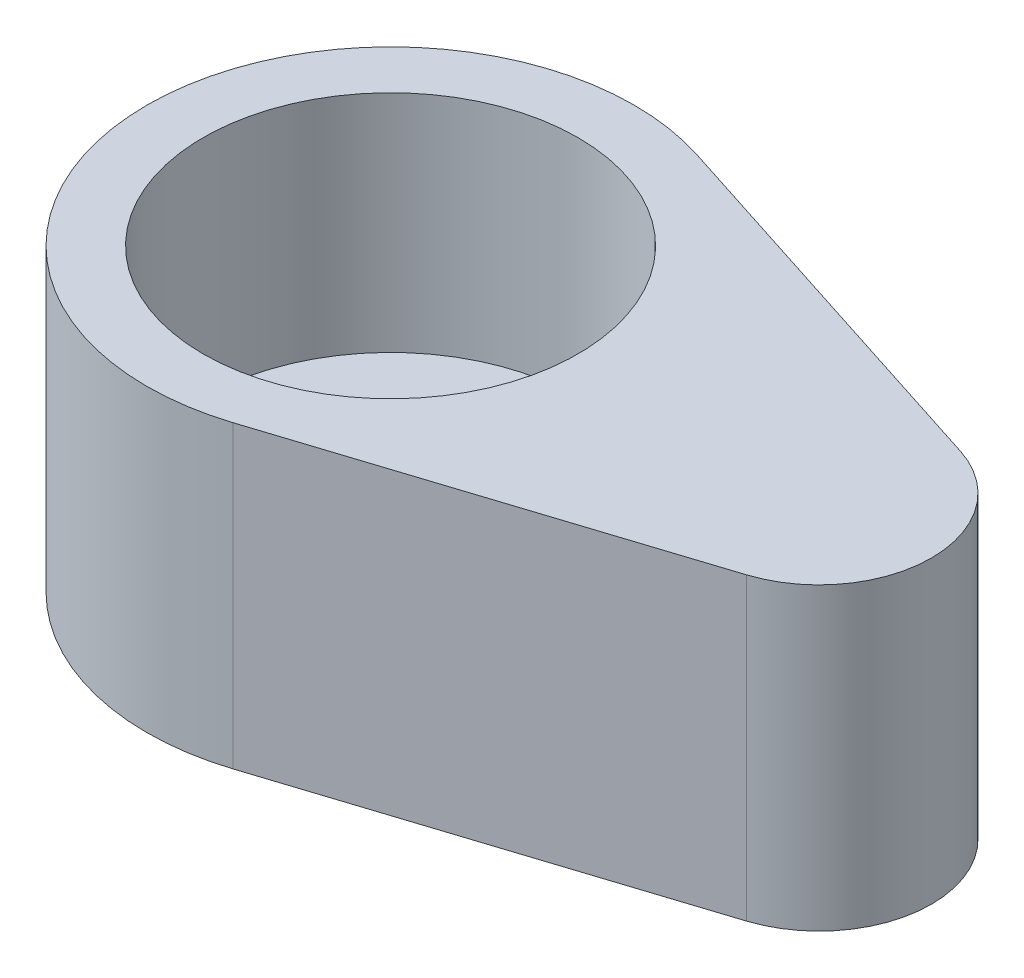
ISO-10303-21;
HEADER;
FILE_DESCRIPTION(('STEP AP214'),'2;1');
FILE_NAME('part.step','',(''),(''),'','','');
FILE_SCHEMA(('AUTOMOTIVE_DESIGN { 1 0 10303 214 1 1 1 1 }'));
ENDSEC;
DATA;
#1=APPLICATION_CONTEXT('core data for automotive mechanical design processes');
#2=APPLICATION_PROTOCOL_DEFINITION('international standard','automotive_design',2000,#1);
#3=PRODUCT_CONTEXT('',#1,'mechanical');
#4=PRODUCT('Part','Part','',(#3));
#5=PRODUCT_RELATED_PRODUCT_CATEGORY('part','',(#4));
#6=PRODUCT_DEFINITION_FORMATION('','',#4);
#7=PRODUCT_DEFINITION_CONTEXT('part definition',#1,'design');
#8=PRODUCT_DEFINITION('design','',#6,#7);
#9=PRODUCT_DEFINITION_SHAPE('','',#8);
#10=(LENGTH_UNIT() NAMED_UNIT(*) SI_UNIT(.MILLI.,.METRE.));
#11=(NAMED_UNIT(*) PLANE_ANGLE_UNIT() SI_UNIT($,.RADIAN.));
#12=(NAMED_UNIT(*) SI_UNIT($,.STERADIAN.) SOLID_ANGLE_UNIT());
#13=UNCERTAINTY_MEASURE_WITH_UNIT(LENGTH_MEASURE(1.E-05),#10,'distance_accuracy_value','');
#14=(GEOMETRIC_REPRESENTATION_CONTEXT(3) GLOBAL_UNCERTAINTY_ASSIGNED_CONTEXT((#13)) GLOBAL_UNIT_ASSIGNED_CONTEXT((#10,
#11,#12)) REPRESENTATION_CONTEXT('',''));
#15=CARTESIAN_POINT('',(0.,0.,0.));
#16=DIRECTION('',(0.,0.,1.));
#17=DIRECTION('',(1.,0.,0.));
#18=AXIS2_PLACEMENT_3D('',#15,#16,#17);
#19=CARTESIAN_POINT('',(0.,8.000000002,0.));
#20=DIRECTION('',(0.,-1.,0.));
#21=DIRECTION('',(0.,0.,-1.));
#22=AXIS2_PLACEMENT_3D('',#19,#20,#21);
#23=CYLINDRICAL_SURFACE('',#22,6.5);
#24=CARTESIAN_POINT('',(0.,0.,0.));
#25=DIRECTION('',(0.,1.,0.));
#26=DIRECTION('',(0.,0.,1.));
#27=AXIS2_PLACEMENT_3D('',#24,#25,#26);
#28=CIRCLE('',#27,6.5);
#29=CARTESIAN_POINT('',(1.99037620297463,0.,-6.18776232337929));
#30=VERTEX_POINT('',#29);
#31=CARTESIAN_POINT('',(1.99037620297463,0.,6.18776232337929));
#32=VERTEX_POINT('',#31);
#33=EDGE_CURVE('E109',#30,#32,#28,.T.);
#34=ORIENTED_EDGE('',*,*,#33,.T.);
#35=DIRECTION('',(0.,-1.,0.));
#36=VECTOR('',#35,1.);
#37=CARTESIAN_POINT('',(1.99037620297463,8.000000002,6.18776232337929));
#38=LINE('',#37,#36);
#39=CARTESIAN_POINT('',(1.99037620297463,8.000000002,6.18776232337929));
#40=VERTEX_POINT('',#39);
#41=EDGE_CURVE('E11',#40,#32,#38,.T.);
#42=ORIENTED_EDGE('',*,*,#41,.F.);
#43=CARTESIAN_POINT('',(0.,8.000000002,0.));
#44=DIRECTION('',(0.,1.,0.));
#45=DIRECTION('',(0.,0.,1.));
#46=AXIS2_PLACEMENT_3D('',#43,#44,#45);
#47=CIRCLE('',#46,6.5);
#48=CARTESIAN_POINT('',(1.99037620297463,8.000000002,-6.18776232337929));
#49=VERTEX_POINT('',#48);
#50=EDGE_CURVE('E93',#49,#40,#47,.T.);
#51=ORIENTED_EDGE('',*,*,#50,.F.);
#52=DIRECTION('',(0.,-1.,0.));
#53=VECTOR('',#52,1.);
#54=CARTESIAN_POINT('',(1.99037620297463,8.000000002,-6.18776232337929));
#55=LINE('',#54,#53);
#56=EDGE_CURVE('E105',#49,#30,#55,.T.);
#57=ORIENTED_EDGE('',*,*,#56,.T.);
#58=EDGE_LOOP('',(#34,#42,#51,#57));
#59=FACE_BOUND('',#58,.T.);
#60=ADVANCED_FACE('F41',(#59),#23,.T.);
#61=CARTESIAN_POINT('',(1.99037620297463,8.000000002,6.18776232337929));
#62=DIRECTION('',(-0.306211723534558,0.,-0.951963434366045));
#63=DIRECTION('',(-0.951963434366045,0.,0.306211723534558));
#64=AXIS2_PLACEMENT_3D('',#61,#62,#63);
#65=PLANE('',#64);
#66=DIRECTION('',(0.951963434366045,0.,-0.306211723534558));
#67=VECTOR('',#66,1.);
#68=CARTESIAN_POINT('',(1.99037620297463,0.,6.18776232337929));
#69=LINE('',#68,#67);
#70=CARTESIAN_POINT('',(12.3486351706037,0.,2.85589030309813));
#71=VERTEX_POINT('',#70);
#72=EDGE_CURVE('E98',#32,#71,#69,.T.);
#73=ORIENTED_EDGE('',*,*,#72,.T.);
#74=DIRECTION('',(0.,-1.,0.));
#75=VECTOR('',#74,1.);
#76=CARTESIAN_POINT('',(12.3486351706037,8.000000002,2.85589030309813));
#77=LINE('',#76,#75);
#78=CARTESIAN_POINT('',(12.3486351706037,8.000000002,2.85589030309813));
#79=VERTEX_POINT('',#78);
#80=EDGE_CURVE('E50',#79,#71,#77,.T.);
#81=ORIENTED_EDGE('',*,*,#80,.F.);
#82=DIRECTION('',(0.951963434366045,0.,-0.306211723534558));
#83=VECTOR('',#82,1.);
#84=CARTESIAN_POINT('',(1.99037620297463,8.000000002,6.18776232337929));
#85=LINE('',#84,#83);
#86=EDGE_CURVE('E88',#40,#79,#85,.T.);
#87=ORIENTED_EDGE('',*,*,#86,.F.);
#88=ORIENTED_EDGE('',*,*,#41,.T.);
#89=EDGE_LOOP('',(#73,#81,#87,#88));
#90=FACE_BOUND('',#89,.T.);
#91=ADVANCED_FACE('F97',(#90),#65,.F.);
#92=CARTESIAN_POINT('',(11.43,8.000000002,0.));
#93=DIRECTION('',(0.,-1.,0.));
#94=DIRECTION('',(0.,0.,-1.));
#95=AXIS2_PLACEMENT_3D('',#92,#93,#94);
#96=CYLINDRICAL_SURFACE('',#95,3.);
#97=CARTESIAN_POINT('',(11.43,0.,0.));
#98=DIRECTION('',(0.,1.,0.));
#99=DIRECTION('',(0.,0.,1.));
#100=AXIS2_PLACEMENT_3D('',#97,#98,#99);
#101=CIRCLE('',#100,3.);
#102=CARTESIAN_POINT('',(12.3486351706037,0.,-2.85589030309813));
#103=VERTEX_POINT('',#102);
#104=EDGE_CURVE('E75',#71,#103,#101,.T.);
#105=ORIENTED_EDGE('',*,*,#104,.T.);
#106=DIRECTION('',(0.,-1.,0.));
#107=VECTOR('',#106,1.);
#108=CARTESIAN_POINT('',(12.3486351706037,8.000000002,-2.85589030309813));
#109=LINE('',#108,#107);
#110=CARTESIAN_POINT('',(12.3486351706037,8.000000002,-2.85589030309813));
#111=VERTEX_POINT('',#110);
#112=EDGE_CURVE('E100',#111,#103,#109,.T.);
#113=ORIENTED_EDGE('',*,*,#112,.F.);
#114=CARTESIAN_POINT('',(11.43,8.000000002,0.));
#115=DIRECTION('',(0.,1.,0.));
#116=DIRECTION('',(0.,0.,1.));
#117=AXIS2_PLACEMENT_3D('',#114,#115,#116);
#118=CIRCLE('',#117,3.);
#119=EDGE_CURVE('E91',#79,#111,#118,.T.);
#120=ORIENTED_EDGE('',*,*,#119,.F.);
#121=ORIENTED_EDGE('',*,*,#80,.T.);
#122=EDGE_LOOP('',(#105,#113,#120,#121));
#123=FACE_BOUND('',#122,.T.);
#124=ADVANCED_FACE('F101',(#123),#96,.T.);
#125=CARTESIAN_POINT('',(1.99037620297463,8.000000002,-6.18776232337929));
#126=DIRECTION('',(-0.306211723534558,0.,0.951963434366045));
#127=DIRECTION('',(0.951963434366045,0.,0.306211723534558));
#128=AXIS2_PLACEMENT_3D('',#125,#126,#127);
#129=PLANE('',#128);
#130=DIRECTION('',(-0.951963434366045,0.,-0.306211723534558));
#131=VECTOR('',#130,1.);
#132=CARTESIAN_POINT('',(1.99037620297463,0.,-6.18776232337929));
#133=LINE('',#132,#131);
#134=EDGE_CURVE('E81',#103,#30,#133,.T.);
#135=ORIENTED_EDGE('',*,*,#134,.T.);
#136=ORIENTED_EDGE('',*,*,#56,.F.);
#137=DIRECTION('',(-0.951963434366045,0.,-0.306211723534558));
#138=VECTOR('',#137,1.);
#139=CARTESIAN_POINT('',(1.99037620297463,8.000000002,-6.18776232337929));
#140=LINE('',#139,#138);
#141=EDGE_CURVE('E58',#111,#49,#140,.T.);
#142=ORIENTED_EDGE('',*,*,#141,.F.);
#143=ORIENTED_EDGE('',*,*,#112,.T.);
#144=EDGE_LOOP('',(#135,#136,#142,#143));
#145=FACE_BOUND('',#144,.T.);
#146=ADVANCED_FACE('F123',(#145),#129,.F.);
#147=CARTESIAN_POINT('',(0.,8.000000002,0.));
#148=DIRECTION('',(0.,1.,0.));
#149=DIRECTION('',(0.,0.,1.));
#150=AXIS2_PLACEMENT_3D('',#147,#148,#149);
#151=PLANE('',#150);
#152=CARTESIAN_POINT('',(0.,8.000000002,0.));
#153=DIRECTION('',(0.,1.,0.));
#154=DIRECTION('',(0.,0.,1.));
#155=AXIS2_PLACEMENT_3D('',#152,#153,#154);
#156=CIRCLE('',#155,5.);
#157=CARTESIAN_POINT('',(0.,8.000000002,5.));
#158=VERTEX_POINT('',#157);
#159=EDGE_CURVE('E130',#158,#158,#156,.T.);
#160=ORIENTED_EDGE('',*,*,#159,.F.);
#161=EDGE_LOOP('',(#160));
#162=FACE_BOUND('',#161,.T.);
#163=ORIENTED_EDGE('',*,*,#50,.T.);
#164=ORIENTED_EDGE('',*,*,#86,.T.);
#165=ORIENTED_EDGE('',*,*,#119,.T.);
#166=ORIENTED_EDGE('',*,*,#141,.T.);
#167=EDGE_LOOP('',(#163,#164,#165,#166));
#168=FACE_BOUND('',#167,.T.);
#169=ADVANCED_FACE('F89',(#162,#168),#151,.T.);
#170=CARTESIAN_POINT('',(0.,0.,0.));
#171=DIRECTION('',(0.,1.,0.));
#172=DIRECTION('',(0.,0.,1.));
#173=AXIS2_PLACEMENT_3D('',#170,#171,#172);
#174=PLANE('',#173);
#175=ORIENTED_EDGE('',*,*,#33,.F.);
#176=ORIENTED_EDGE('',*,*,#134,.F.);
#177=ORIENTED_EDGE('',*,*,#104,.F.);
#178=ORIENTED_EDGE('',*,*,#72,.F.);
#179=EDGE_LOOP('',(#175,#176,#177,#178));
#180=FACE_BOUND('',#179,.T.);
#181=ADVANCED_FACE('F126',(#180),#174,.F.);
#182=CARTESIAN_POINT('',(0.,2.000000064,0.));
#183=DIRECTION('',(0.,1.,0.));
#184=DIRECTION('',(0.,0.,1.));
#185=AXIS2_PLACEMENT_3D('',#182,#183,#184);
#186=CYLINDRICAL_SURFACE('',#185,5.);
#187=CARTESIAN_POINT('',(0.,2.000000064,0.));
#188=DIRECTION('',(0.,1.,0.));
#189=DIRECTION('',(0.,0.,1.));
#190=AXIS2_PLACEMENT_3D('',#187,#188,#189);
#191=CIRCLE('',#190,5.);
#192=CARTESIAN_POINT('',(0.,2.000000064,5.));
#193=VERTEX_POINT('',#192);
#194=EDGE_CURVE('E113',#193,#193,#191,.T.);
#195=ORIENTED_EDGE('',*,*,#194,.F.);
#196=EDGE_LOOP('',(#195));
#197=FACE_BOUND('',#196,.T.);
#198=ORIENTED_EDGE('',*,*,#159,.T.);
#199=EDGE_LOOP('',(#198));
#200=FACE_BOUND('',#199,.T.);
#201=ADVANCED_FACE('F140',(#197,#200),#186,.F.);
#202=CARTESIAN_POINT('',(0.,2.000000064,0.));
#203=DIRECTION('',(0.,1.,0.));
#204=DIRECTION('',(0.,0.,1.));
#205=AXIS2_PLACEMENT_3D('',#202,#203,#204);
#206=PLANE('',#205);
#207=ORIENTED_EDGE('',*,*,#194,.T.);
#208=EDGE_LOOP('',(#207));
#209=FACE_BOUND('',#208,.T.);
#210=ADVANCED_FACE('F138',(#209),#206,.T.);
#211=CLOSED_SHELL('',(#60,#91,#124,#146,#169,#181,#201,#210));
#212=MANIFOLD_SOLID_BREP('B2',#211);
#213=ADVANCED_BREP_SHAPE_REPRESENTATION('',(#18,#212),#14);
#214=SHAPE_DEFINITION_REPRESENTATION(#9,#213);
ENDSEC;
END-ISO-10303-21;
